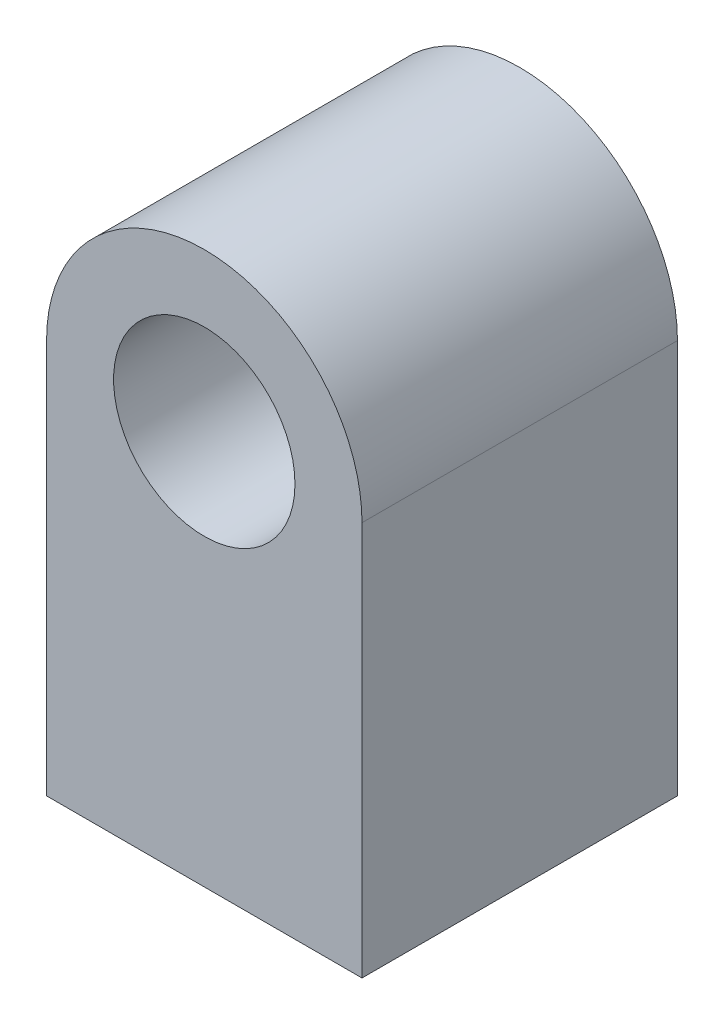
ISO-10303-21;
HEADER;
FILE_DESCRIPTION(('STEP AP214'),'2;1');
FILE_NAME('part.step','',(''),(''),'','','');
FILE_SCHEMA(('AUTOMOTIVE_DESIGN { 1 0 10303 214 1 1 1 1 }'));
ENDSEC;
DATA;
#1=APPLICATION_CONTEXT('core data for automotive mechanical design processes');
#2=APPLICATION_PROTOCOL_DEFINITION('international standard','automotive_design',2000,#1);
#3=PRODUCT_CONTEXT('',#1,'mechanical');
#4=PRODUCT('Part','Part','',(#3));
#5=PRODUCT_RELATED_PRODUCT_CATEGORY('part','',(#4));
#6=PRODUCT_DEFINITION_FORMATION('','',#4);
#7=PRODUCT_DEFINITION_CONTEXT('part definition',#1,'design');
#8=PRODUCT_DEFINITION('design','',#6,#7);
#9=PRODUCT_DEFINITION_SHAPE('','',#8);
#10=(LENGTH_UNIT() NAMED_UNIT(*) SI_UNIT(.MILLI.,.METRE.));
#11=(NAMED_UNIT(*) PLANE_ANGLE_UNIT() SI_UNIT($,.RADIAN.));
#12=(NAMED_UNIT(*) SI_UNIT($,.STERADIAN.) SOLID_ANGLE_UNIT());
#13=UNCERTAINTY_MEASURE_WITH_UNIT(LENGTH_MEASURE(1.E-05),#10,'distance_accuracy_value','');
#14=(GEOMETRIC_REPRESENTATION_CONTEXT(3) GLOBAL_UNCERTAINTY_ASSIGNED_CONTEXT((#13)) GLOBAL_UNIT_ASSIGNED_CONTEXT((#10,
#11,#12)) REPRESENTATION_CONTEXT('',''));
#15=CARTESIAN_POINT('',(0.,0.,0.));
#16=DIRECTION('',(0.,0.,1.));
#17=DIRECTION('',(1.,0.,0.));
#18=AXIS2_PLACEMENT_3D('',#15,#16,#17);
#19=CARTESIAN_POINT('',(0.,0.,4.));
#20=DIRECTION('',(0.,0.,1.));
#21=DIRECTION('',(1.,0.,0.));
#22=AXIS2_PLACEMENT_3D('',#19,#20,#21);
#23=PLANE('',#22);
#24=CARTESIAN_POINT('',(0.,0.,4.));
#25=DIRECTION('',(0.,0.,1.));
#26=DIRECTION('',(1.,0.,0.));
#27=AXIS2_PLACEMENT_3D('',#24,#25,#26);
#28=CIRCLE('',#27,2.);
#29=CARTESIAN_POINT('',(2.,0.,4.));
#30=VERTEX_POINT('',#29);
#31=CARTESIAN_POINT('',(-2.,0.,4.));
#32=VERTEX_POINT('',#31);
#33=EDGE_CURVE('E95',#30,#32,#28,.T.);
#34=ORIENTED_EDGE('',*,*,#33,.T.);
#35=DIRECTION('',(0.,-1.,0.));
#36=VECTOR('',#35,1.);
#37=CARTESIAN_POINT('',(-2.,-5.,4.));
#38=LINE('',#37,#36);
#39=CARTESIAN_POINT('',(-2.,-5.,4.));
#40=VERTEX_POINT('',#39);
#41=EDGE_CURVE('E90',#32,#40,#38,.T.);
#42=ORIENTED_EDGE('',*,*,#41,.T.);
#43=DIRECTION('',(1.,0.,0.));
#44=VECTOR('',#43,1.);
#45=CARTESIAN_POINT('',(2.,-5.,4.));
#46=LINE('',#45,#44);
#47=CARTESIAN_POINT('',(2.,-5.,4.));
#48=VERTEX_POINT('',#47);
#49=EDGE_CURVE('E93',#40,#48,#46,.T.);
#50=ORIENTED_EDGE('',*,*,#49,.T.);
#51=DIRECTION('',(0.,1.,0.));
#52=VECTOR('',#51,1.);
#53=CARTESIAN_POINT('',(2.,0.,4.));
#54=LINE('',#53,#52);
#55=EDGE_CURVE('E60',#48,#30,#54,.T.);
#56=ORIENTED_EDGE('',*,*,#55,.T.);
#57=EDGE_LOOP('',(#34,#42,#50,#56));
#58=FACE_BOUND('',#57,.T.);
#59=CARTESIAN_POINT('',(0.,0.,4.));
#60=DIRECTION('',(0.,0.,1.));
#61=DIRECTION('',(1.,0.,0.));
#62=AXIS2_PLACEMENT_3D('',#59,#60,#61);
#63=CIRCLE('',#62,1.15);
#64=CARTESIAN_POINT('',(1.15,0.,4.));
#65=VERTEX_POINT('',#64);
#66=EDGE_CURVE('E110',#65,#65,#63,.T.);
#67=ORIENTED_EDGE('',*,*,#66,.F.);
#68=EDGE_LOOP('',(#67));
#69=FACE_BOUND('',#68,.T.);
#70=ADVANCED_FACE('F43',(#58,#69),#23,.T.);
#71=CARTESIAN_POINT('',(0.,0.,0.));
#72=DIRECTION('',(0.,0.,1.));
#73=DIRECTION('',(1.,0.,0.));
#74=AXIS2_PLACEMENT_3D('',#71,#72,#73);
#75=PLANE('',#74);
#76=CARTESIAN_POINT('',(0.,0.,0.));
#77=DIRECTION('',(0.,0.,1.));
#78=DIRECTION('',(1.,0.,0.));
#79=AXIS2_PLACEMENT_3D('',#76,#77,#78);
#80=CIRCLE('',#79,2.);
#81=CARTESIAN_POINT('',(2.,0.,0.));
#82=VERTEX_POINT('',#81);
#83=CARTESIAN_POINT('',(-2.,0.,0.));
#84=VERTEX_POINT('',#83);
#85=EDGE_CURVE('E107',#82,#84,#80,.T.);
#86=ORIENTED_EDGE('',*,*,#85,.F.);
#87=DIRECTION('',(0.,1.,0.));
#88=VECTOR('',#87,1.);
#89=CARTESIAN_POINT('',(2.,0.,0.));
#90=LINE('',#89,#88);
#91=CARTESIAN_POINT('',(2.,-5.,0.));
#92=VERTEX_POINT('',#91);
#93=EDGE_CURVE('E83',#92,#82,#90,.T.);
#94=ORIENTED_EDGE('',*,*,#93,.F.);
#95=DIRECTION('',(1.,0.,0.));
#96=VECTOR('',#95,1.);
#97=CARTESIAN_POINT('',(2.,-5.,0.));
#98=LINE('',#97,#96);
#99=CARTESIAN_POINT('',(-2.,-5.,0.));
#100=VERTEX_POINT('',#99);
#101=EDGE_CURVE('E77',#100,#92,#98,.T.);
#102=ORIENTED_EDGE('',*,*,#101,.F.);
#103=DIRECTION('',(0.,-1.,0.));
#104=VECTOR('',#103,1.);
#105=CARTESIAN_POINT('',(-2.,-5.,0.));
#106=LINE('',#105,#104);
#107=EDGE_CURVE('E99',#84,#100,#106,.T.);
#108=ORIENTED_EDGE('',*,*,#107,.F.);
#109=EDGE_LOOP('',(#86,#94,#102,#108));
#110=FACE_BOUND('',#109,.T.);
#111=CARTESIAN_POINT('',(0.,0.,0.));
#112=DIRECTION('',(0.,0.,1.));
#113=DIRECTION('',(1.,0.,0.));
#114=AXIS2_PLACEMENT_3D('',#111,#112,#113);
#115=CIRCLE('',#114,1.15);
#116=CARTESIAN_POINT('',(1.15,0.,0.));
#117=VERTEX_POINT('',#116);
#118=EDGE_CURVE('E122',#117,#117,#115,.T.);
#119=ORIENTED_EDGE('',*,*,#118,.T.);
#120=EDGE_LOOP('',(#119));
#121=FACE_BOUND('',#120,.T.);
#122=ADVANCED_FACE('F118',(#110,#121),#75,.F.);
#123=CARTESIAN_POINT('',(0.,0.,4.));
#124=DIRECTION('',(0.,0.,-1.));
#125=DIRECTION('',(-1.,0.,0.));
#126=AXIS2_PLACEMENT_3D('',#123,#124,#125);
#127=CYLINDRICAL_SURFACE('',#126,2.);
#128=ORIENTED_EDGE('',*,*,#85,.T.);
#129=DIRECTION('',(0.,0.,-1.));
#130=VECTOR('',#129,1.);
#131=CARTESIAN_POINT('',(-2.,0.,4.));
#132=LINE('',#131,#130);
#133=EDGE_CURVE('E11',#32,#84,#132,.T.);
#134=ORIENTED_EDGE('',*,*,#133,.F.);
#135=ORIENTED_EDGE('',*,*,#33,.F.);
#136=DIRECTION('',(0.,0.,-1.));
#137=VECTOR('',#136,1.);
#138=CARTESIAN_POINT('',(2.,0.,4.));
#139=LINE('',#138,#137);
#140=EDGE_CURVE('E103',#30,#82,#139,.T.);
#141=ORIENTED_EDGE('',*,*,#140,.T.);
#142=EDGE_LOOP('',(#128,#134,#135,#141));
#143=FACE_BOUND('',#142,.T.);
#144=ADVANCED_FACE('F45',(#143),#127,.T.);
#145=CARTESIAN_POINT('',(-2.,-5.,4.));
#146=DIRECTION('',(1.,0.,0.));
#147=DIRECTION('',(0.,1.,0.));
#148=AXIS2_PLACEMENT_3D('',#145,#146,#147);
#149=PLANE('',#148);
#150=ORIENTED_EDGE('',*,*,#107,.T.);
#151=DIRECTION('',(0.,0.,-1.));
#152=VECTOR('',#151,1.);
#153=CARTESIAN_POINT('',(-2.,-5.,4.));
#154=LINE('',#153,#152);
#155=EDGE_CURVE('E52',#40,#100,#154,.T.);
#156=ORIENTED_EDGE('',*,*,#155,.F.);
#157=ORIENTED_EDGE('',*,*,#41,.F.);
#158=ORIENTED_EDGE('',*,*,#133,.T.);
#159=EDGE_LOOP('',(#150,#156,#157,#158));
#160=FACE_BOUND('',#159,.T.);
#161=ADVANCED_FACE('F98',(#160),#149,.F.);
#162=CARTESIAN_POINT('',(2.,-5.,4.));
#163=DIRECTION('',(0.,1.,0.));
#164=DIRECTION('',(0.,0.,1.));
#165=AXIS2_PLACEMENT_3D('',#162,#163,#164);
#166=PLANE('',#165);
#167=CARTESIAN_POINT('',(0.,-5.,2.));
#168=DIRECTION('',(0.,-1.,0.));
#169=DIRECTION('',(0.,0.,-1.));
#170=AXIS2_PLACEMENT_3D('',#167,#168,#169);
#171=CIRCLE('',#170,1.);
#172=CARTESIAN_POINT('',(0.,-5.,1.));
#173=VERTEX_POINT('',#172);
#174=EDGE_CURVE('E128',#173,#173,#171,.T.);
#175=ORIENTED_EDGE('',*,*,#174,.F.);
#176=EDGE_LOOP('',(#175));
#177=FACE_BOUND('',#176,.T.);
#178=ORIENTED_EDGE('',*,*,#101,.T.);
#179=DIRECTION('',(0.,0.,-1.));
#180=VECTOR('',#179,1.);
#181=CARTESIAN_POINT('',(2.,-5.,4.));
#182=LINE('',#181,#180);
#183=EDGE_CURVE('E100',#48,#92,#182,.T.);
#184=ORIENTED_EDGE('',*,*,#183,.F.);
#185=ORIENTED_EDGE('',*,*,#49,.F.);
#186=ORIENTED_EDGE('',*,*,#155,.T.);
#187=EDGE_LOOP('',(#178,#184,#185,#186));
#188=FACE_BOUND('',#187,.T.);
#189=ADVANCED_FACE('F101',(#177,#188),#166,.F.);
#190=CARTESIAN_POINT('',(2.,0.,4.));
#191=DIRECTION('',(-1.,0.,0.));
#192=DIRECTION('',(0.,-1.,0.));
#193=AXIS2_PLACEMENT_3D('',#190,#191,#192);
#194=PLANE('',#193);
#195=ORIENTED_EDGE('',*,*,#93,.T.);
#196=ORIENTED_EDGE('',*,*,#140,.F.);
#197=ORIENTED_EDGE('',*,*,#55,.F.);
#198=ORIENTED_EDGE('',*,*,#183,.T.);
#199=EDGE_LOOP('',(#195,#196,#197,#198));
#200=FACE_BOUND('',#199,.T.);
#201=ADVANCED_FACE('F115',(#200),#194,.F.);
#202=CARTESIAN_POINT('',(0.,0.,4.));
#203=DIRECTION('',(0.,0.,-1.));
#204=DIRECTION('',(-1.,0.,0.));
#205=AXIS2_PLACEMENT_3D('',#202,#203,#204);
#206=CYLINDRICAL_SURFACE('',#205,1.15);
#207=ORIENTED_EDGE('',*,*,#66,.T.);
#208=EDGE_LOOP('',(#207));
#209=FACE_BOUND('',#208,.T.);
#210=ORIENTED_EDGE('',*,*,#118,.F.);
#211=EDGE_LOOP('',(#210));
#212=FACE_BOUND('',#211,.T.);
#213=ADVANCED_FACE('F139',(#209,#212),#206,.F.);
#214=CARTESIAN_POINT('',(0.,-1.5,2.));
#215=DIRECTION('',(0.,-1.,0.));
#216=DIRECTION('',(0.,0.,-1.));
#217=AXIS2_PLACEMENT_3D('',#214,#215,#216);
#218=CYLINDRICAL_SURFACE('',#217,1.);
#219=CARTESIAN_POINT('',(0.,-1.5,2.));
#220=DIRECTION('',(0.,-1.,0.));
#221=DIRECTION('',(0.,0.,-1.));
#222=AXIS2_PLACEMENT_3D('',#219,#220,#221);
#223=CIRCLE('',#222,1.);
#224=CARTESIAN_POINT('',(0.,-1.5,1.));
#225=VERTEX_POINT('',#224);
#226=EDGE_CURVE('E125',#225,#225,#223,.T.);
#227=ORIENTED_EDGE('',*,*,#226,.F.);
#228=EDGE_LOOP('',(#227));
#229=FACE_BOUND('',#228,.T.);
#230=ORIENTED_EDGE('',*,*,#174,.T.);
#231=EDGE_LOOP('',(#230));
#232=FACE_BOUND('',#231,.T.);
#233=ADVANCED_FACE('F136',(#229,#232),#218,.F.);
#234=CARTESIAN_POINT('',(0.,-1.5,2.));
#235=DIRECTION('',(0.,-1.,0.));
#236=DIRECTION('',(0.,0.,-1.));
#237=AXIS2_PLACEMENT_3D('',#234,#235,#236);
#238=PLANE('',#237);
#239=ORIENTED_EDGE('',*,*,#226,.T.);
#240=EDGE_LOOP('',(#239));
#241=FACE_BOUND('',#240,.T.);
#242=ADVANCED_FACE('F134',(#241),#238,.T.);
#243=CLOSED_SHELL('',(#70,#122,#144,#161,#189,#201,#213,#233,#242));
#244=MANIFOLD_SOLID_BREP('B2',#243);
#245=ADVANCED_BREP_SHAPE_REPRESENTATION('',(#18,#244),#14);
#246=SHAPE_DEFINITION_REPRESENTATION(#9,#245);
ENDSEC;
END-ISO-10303-21;
